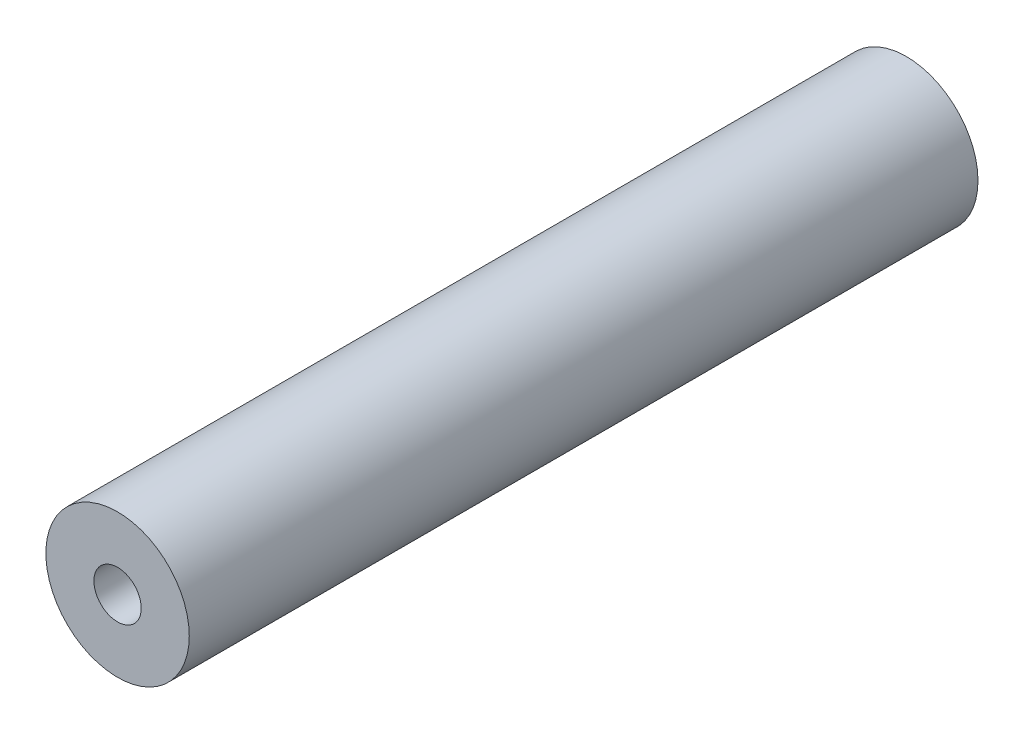
ISO-10303-21;
HEADER;
FILE_DESCRIPTION(('STEP AP214'),'2;1');
FILE_NAME('part.step','',(''),(''),'','','');
FILE_SCHEMA(('AUTOMOTIVE_DESIGN { 1 0 10303 214 1 1 1 1 }'));
ENDSEC;
DATA;
#1=APPLICATION_CONTEXT('core data for automotive mechanical design processes');
#2=APPLICATION_PROTOCOL_DEFINITION('international standard','automotive_design',2000,#1);
#3=PRODUCT_CONTEXT('',#1,'mechanical');
#4=PRODUCT('Part','Part','',(#3));
#5=PRODUCT_RELATED_PRODUCT_CATEGORY('part','',(#4));
#6=PRODUCT_DEFINITION_FORMATION('','',#4);
#7=PRODUCT_DEFINITION_CONTEXT('part definition',#1,'design');
#8=PRODUCT_DEFINITION('design','',#6,#7);
#9=PRODUCT_DEFINITION_SHAPE('','',#8);
#10=(LENGTH_UNIT() NAMED_UNIT(*) SI_UNIT(.MILLI.,.METRE.));
#11=(NAMED_UNIT(*) PLANE_ANGLE_UNIT() SI_UNIT($,.RADIAN.));
#12=(NAMED_UNIT(*) SI_UNIT($,.STERADIAN.) SOLID_ANGLE_UNIT());
#13=UNCERTAINTY_MEASURE_WITH_UNIT(LENGTH_MEASURE(1.E-05),#10,'distance_accuracy_value','');
#14=(GEOMETRIC_REPRESENTATION_CONTEXT(3) GLOBAL_UNCERTAINTY_ASSIGNED_CONTEXT((#13)) GLOBAL_UNIT_ASSIGNED_CONTEXT((#10,
#11,#12)) REPRESENTATION_CONTEXT('',''));
#15=CARTESIAN_POINT('',(0.,0.,0.));
#16=DIRECTION('',(0.,0.,1.));
#17=DIRECTION('',(1.,0.,0.));
#18=AXIS2_PLACEMENT_3D('',#15,#16,#17);
#19=CARTESIAN_POINT('',(0.,0.,55.));
#20=DIRECTION('',(0.,0.,-1.));
#21=DIRECTION('',(-1.,0.,0.));
#22=AXIS2_PLACEMENT_3D('',#19,#20,#21);
#23=CYLINDRICAL_SURFACE('',#22,5.);
#24=CARTESIAN_POINT('',(0.,0.,55.));
#25=DIRECTION('',(0.,0.,1.));
#26=DIRECTION('',(1.,0.,0.));
#27=AXIS2_PLACEMENT_3D('',#24,#25,#26);
#28=CIRCLE('',#27,5.);
#29=CARTESIAN_POINT('',(5.,0.,55.));
#30=VERTEX_POINT('',#29);
#31=EDGE_CURVE('E10',#30,#30,#28,.T.);
#32=ORIENTED_EDGE('',*,*,#31,.F.);
#33=EDGE_LOOP('',(#32));
#34=FACE_BOUND('',#33,.T.);
#35=CARTESIAN_POINT('',(0.,0.,0.));
#36=DIRECTION('',(0.,0.,1.));
#37=DIRECTION('',(1.,0.,0.));
#38=AXIS2_PLACEMENT_3D('',#35,#36,#37);
#39=CIRCLE('',#38,5.);
#40=CARTESIAN_POINT('',(5.,0.,0.));
#41=VERTEX_POINT('',#40);
#42=EDGE_CURVE('E36',#41,#41,#39,.T.);
#43=ORIENTED_EDGE('',*,*,#42,.T.);
#44=EDGE_LOOP('',(#43));
#45=FACE_BOUND('',#44,.T.);
#46=ADVANCED_FACE('F33',(#34,#45),#23,.T.);
#47=CARTESIAN_POINT('',(0.,0.,55.));
#48=DIRECTION('',(0.,0.,1.));
#49=DIRECTION('',(1.,0.,0.));
#50=AXIS2_PLACEMENT_3D('',#47,#48,#49);
#51=PLANE('',#50);
#52=CARTESIAN_POINT('',(0.,0.,55.));
#53=DIRECTION('',(0.,0.,1.));
#54=DIRECTION('',(1.,0.,0.));
#55=AXIS2_PLACEMENT_3D('',#52,#53,#54);
#56=CIRCLE('',#55,1.65);
#57=CARTESIAN_POINT('',(1.65,0.,55.));
#58=VERTEX_POINT('',#57);
#59=EDGE_CURVE('E45',#58,#58,#56,.T.);
#60=ORIENTED_EDGE('',*,*,#59,.F.);
#61=EDGE_LOOP('',(#60));
#62=FACE_BOUND('',#61,.T.);
#63=ORIENTED_EDGE('',*,*,#31,.T.);
#64=EDGE_LOOP('',(#63));
#65=FACE_BOUND('',#64,.T.);
#66=ADVANCED_FACE('F70',(#62,#65),#51,.T.);
#67=CARTESIAN_POINT('',(0.,0.,0.));
#68=DIRECTION('',(0.,0.,1.));
#69=DIRECTION('',(1.,0.,0.));
#70=AXIS2_PLACEMENT_3D('',#67,#68,#69);
#71=PLANE('',#70);
#72=CARTESIAN_POINT('',(0.,0.,0.));
#73=DIRECTION('',(0.,0.,-1.));
#74=DIRECTION('',(-1.,0.,0.));
#75=AXIS2_PLACEMENT_3D('',#72,#73,#74);
#76=CIRCLE('',#75,1.65);
#77=CARTESIAN_POINT('',(-1.65,0.,0.));
#78=VERTEX_POINT('',#77);
#79=EDGE_CURVE('E51',#78,#78,#76,.T.);
#80=ORIENTED_EDGE('',*,*,#79,.F.);
#81=EDGE_LOOP('',(#80));
#82=FACE_BOUND('',#81,.T.);
#83=ORIENTED_EDGE('',*,*,#42,.F.);
#84=EDGE_LOOP('',(#83));
#85=FACE_BOUND('',#84,.T.);
#86=ADVANCED_FACE('F66',(#82,#85),#71,.F.);
#87=CARTESIAN_POINT('',(0.,0.,45.));
#88=DIRECTION('',(0.,0.,1.));
#89=DIRECTION('',(1.,0.,0.));
#90=AXIS2_PLACEMENT_3D('',#87,#88,#89);
#91=CYLINDRICAL_SURFACE('',#90,1.65);
#92=CARTESIAN_POINT('',(0.,0.,45.));
#93=DIRECTION('',(0.,0.,1.));
#94=DIRECTION('',(1.,0.,0.));
#95=AXIS2_PLACEMENT_3D('',#92,#93,#94);
#96=CIRCLE('',#95,1.65);
#97=CARTESIAN_POINT('',(1.65,0.,45.));
#98=VERTEX_POINT('',#97);
#99=EDGE_CURVE('E43',#98,#98,#96,.T.);
#100=ORIENTED_EDGE('',*,*,#99,.F.);
#101=EDGE_LOOP('',(#100));
#102=FACE_BOUND('',#101,.T.);
#103=ORIENTED_EDGE('',*,*,#59,.T.);
#104=EDGE_LOOP('',(#103));
#105=FACE_BOUND('',#104,.T.);
#106=ADVANCED_FACE('F69',(#102,#105),#91,.F.);
#107=CARTESIAN_POINT('',(0.,0.,45.));
#108=DIRECTION('',(0.,0.,1.));
#109=DIRECTION('',(1.,0.,0.));
#110=AXIS2_PLACEMENT_3D('',#107,#108,#109);
#111=PLANE('',#110);
#112=ORIENTED_EDGE('',*,*,#99,.T.);
#113=EDGE_LOOP('',(#112));
#114=FACE_BOUND('',#113,.T.);
#115=ADVANCED_FACE('F62',(#114),#111,.T.);
#116=CARTESIAN_POINT('',(0.,0.,10.));
#117=DIRECTION('',(0.,0.,-1.));
#118=DIRECTION('',(-1.,0.,0.));
#119=AXIS2_PLACEMENT_3D('',#116,#117,#118);
#120=CYLINDRICAL_SURFACE('',#119,1.65);
#121=CARTESIAN_POINT('',(0.,0.,10.));
#122=DIRECTION('',(0.,0.,-1.));
#123=DIRECTION('',(-1.,0.,0.));
#124=AXIS2_PLACEMENT_3D('',#121,#122,#123);
#125=CIRCLE('',#124,1.65);
#126=CARTESIAN_POINT('',(-1.65,0.,10.));
#127=VERTEX_POINT('',#126);
#128=EDGE_CURVE('E48',#127,#127,#125,.T.);
#129=ORIENTED_EDGE('',*,*,#128,.F.);
#130=EDGE_LOOP('',(#129));
#131=FACE_BOUND('',#130,.T.);
#132=ORIENTED_EDGE('',*,*,#79,.T.);
#133=EDGE_LOOP('',(#132));
#134=FACE_BOUND('',#133,.T.);
#135=ADVANCED_FACE('F59',(#131,#134),#120,.F.);
#136=CARTESIAN_POINT('',(0.,0.,10.));
#137=DIRECTION('',(0.,0.,-1.));
#138=DIRECTION('',(-1.,0.,0.));
#139=AXIS2_PLACEMENT_3D('',#136,#137,#138);
#140=PLANE('',#139);
#141=ORIENTED_EDGE('',*,*,#128,.T.);
#142=EDGE_LOOP('',(#141));
#143=FACE_BOUND('',#142,.T.);
#144=ADVANCED_FACE('F57',(#143),#140,.T.);
#145=CLOSED_SHELL('',(#46,#66,#86,#106,#115,#135,#144));
#146=MANIFOLD_SOLID_BREP('B2',#145);
#147=ADVANCED_BREP_SHAPE_REPRESENTATION('',(#18,#146),#14);
#148=SHAPE_DEFINITION_REPRESENTATION(#9,#147);
ENDSEC;
END-ISO-10303-21;
